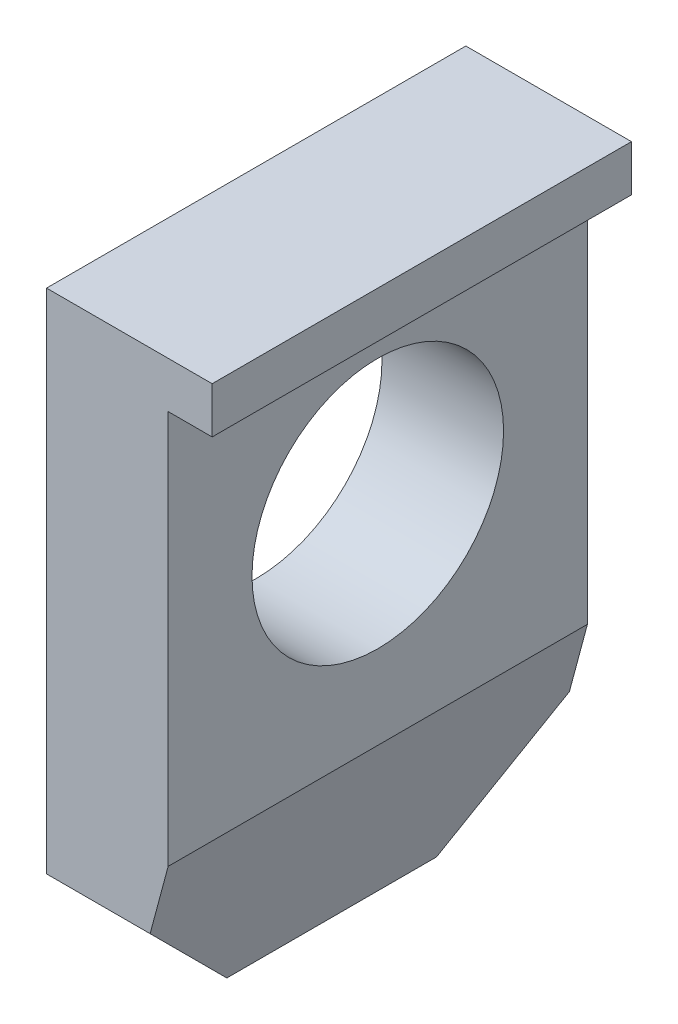
ISO-10303-21;
HEADER;
FILE_DESCRIPTION(('STEP AP214'),'2;1');
FILE_NAME('part.step','',(''),(''),'','','');
FILE_SCHEMA(('AUTOMOTIVE_DESIGN { 1 0 10303 214 1 1 1 1 }'));
ENDSEC;
DATA;
#1=APPLICATION_CONTEXT('core data for automotive mechanical design processes');
#2=APPLICATION_PROTOCOL_DEFINITION('international standard','automotive_design',2000,#1);
#3=PRODUCT_CONTEXT('',#1,'mechanical');
#4=PRODUCT('Part','Part','',(#3));
#5=PRODUCT_RELATED_PRODUCT_CATEGORY('part','',(#4));
#6=PRODUCT_DEFINITION_FORMATION('','',#4);
#7=PRODUCT_DEFINITION_CONTEXT('part definition',#1,'design');
#8=PRODUCT_DEFINITION('design','',#6,#7);
#9=PRODUCT_DEFINITION_SHAPE('','',#8);
#10=(LENGTH_UNIT() NAMED_UNIT(*) SI_UNIT(.MILLI.,.METRE.));
#11=(NAMED_UNIT(*) PLANE_ANGLE_UNIT() SI_UNIT($,.RADIAN.));
#12=(NAMED_UNIT(*) SI_UNIT($,.STERADIAN.) SOLID_ANGLE_UNIT());
#13=UNCERTAINTY_MEASURE_WITH_UNIT(LENGTH_MEASURE(1.E-05),#10,'distance_accuracy_value','');
#14=(GEOMETRIC_REPRESENTATION_CONTEXT(3) GLOBAL_UNCERTAINTY_ASSIGNED_CONTEXT((#13)) GLOBAL_UNIT_ASSIGNED_CONTEXT((#10,
#11,#12)) REPRESENTATION_CONTEXT('',''));
#15=CARTESIAN_POINT('',(0.,0.,0.));
#16=DIRECTION('',(0.,0.,1.));
#17=DIRECTION('',(1.,0.,0.));
#18=AXIS2_PLACEMENT_3D('',#15,#16,#17);
#19=CARTESIAN_POINT('',(0.,9.1,5.));
#20=DIRECTION('',(1.,0.,0.));
#21=DIRECTION('',(0.,1.,0.));
#22=AXIS2_PLACEMENT_3D('',#19,#20,#21);
#23=CYLINDRICAL_SURFACE('',#22,3.);
#24=CARTESIAN_POINT('',(0.,9.1,5.));
#25=DIRECTION('',(1.,0.,0.));
#26=DIRECTION('',(0.,1.,0.));
#27=AXIS2_PLACEMENT_3D('',#24,#25,#26);
#28=CIRCLE('',#27,3.);
#29=CARTESIAN_POINT('',(0.,6.1,5.));
#30=VERTEX_POINT('',#29);
#31=EDGE_CURVE('E184',#30,#30,#28,.T.);
#32=ORIENTED_EDGE('',*,*,#31,.F.);
#33=DIRECTION('',(1.,0.,0.));
#34=VECTOR('',#33,1.);
#35=CARTESIAN_POINT('',(0.,6.1,5.));
#36=LINE('',#35,#34);
#37=CARTESIAN_POINT('',(2.9,6.1,5.));
#38=VERTEX_POINT('',#37);
#39=EDGE_CURVE('E11',#30,#38,#36,.T.);
#40=ORIENTED_EDGE('',*,*,#39,.T.);
#41=CARTESIAN_POINT('',(2.9,9.1,5.));
#42=DIRECTION('',(1.,0.,0.));
#43=DIRECTION('',(0.,1.,0.));
#44=AXIS2_PLACEMENT_3D('',#41,#42,#43);
#45=CIRCLE('',#44,3.);
#46=EDGE_CURVE('E158',#38,#38,#45,.T.);
#47=ORIENTED_EDGE('',*,*,#46,.T.);
#48=ORIENTED_EDGE('',*,*,#39,.F.);
#49=EDGE_LOOP('',(#32,#40,#47,#48));
#50=FACE_BOUND('',#49,.T.);
#51=ADVANCED_FACE('F17',(#50),#23,.F.);
#52=CARTESIAN_POINT('',(0.,2.5,10.));
#53=DIRECTION('',(0.,0.707106781186548,-0.707106781186548));
#54=DIRECTION('',(-1.,0.,0.));
#55=AXIS2_PLACEMENT_3D('',#52,#53,#54);
#56=PLANE('',#55);
#57=DIRECTION('',(-0.186156787897391,-0.694746590606865,-0.694746590606865));
#58=VECTOR('',#57,1.);
#59=CARTESIAN_POINT('',(2.469872981078,2.5,10.));
#60=LINE('',#59,#58);
#61=CARTESIAN_POINT('',(2.469872981078,2.5,10.));
#62=VERTEX_POINT('',#61);
#63=CARTESIAN_POINT('',(1.8,0.,7.5));
#64=VERTEX_POINT('',#63);
#65=EDGE_CURVE('E226',#62,#64,#60,.T.);
#66=ORIENTED_EDGE('',*,*,#65,.F.);
#67=DIRECTION('',(1.,0.,0.));
#68=VECTOR('',#67,1.);
#69=CARTESIAN_POINT('',(0.,2.5,10.));
#70=LINE('',#69,#68);
#71=CARTESIAN_POINT('',(0.,2.5,10.));
#72=VERTEX_POINT('',#71);
#73=EDGE_CURVE('E28',#72,#62,#70,.T.);
#74=ORIENTED_EDGE('',*,*,#73,.F.);
#75=DIRECTION('',(0.,-0.707106781186548,-0.707106781186548));
#76=VECTOR('',#75,1.);
#77=CARTESIAN_POINT('',(0.,2.5,10.));
#78=LINE('',#77,#76);
#79=CARTESIAN_POINT('',(0.,0.,7.5));
#80=VERTEX_POINT('',#79);
#81=EDGE_CURVE('E96',#72,#80,#78,.T.);
#82=ORIENTED_EDGE('',*,*,#81,.T.);
#83=DIRECTION('',(1.,0.,0.));
#84=VECTOR('',#83,1.);
#85=CARTESIAN_POINT('',(0.,0.,7.5));
#86=LINE('',#85,#84);
#87=EDGE_CURVE('E188',#80,#64,#86,.T.);
#88=ORIENTED_EDGE('',*,*,#87,.T.);
#89=EDGE_LOOP('',(#66,#74,#82,#88));
#90=FACE_BOUND('',#89,.T.);
#91=ADVANCED_FACE('F344',(#90),#56,.F.);
#92=CARTESIAN_POINT('',(0.,0.,10.));
#93=DIRECTION('',(0.,0.,1.));
#94=DIRECTION('',(1.,0.,0.));
#95=AXIS2_PLACEMENT_3D('',#92,#93,#94);
#96=PLANE('',#95);
#97=ORIENTED_EDGE('',*,*,#73,.T.);
#98=DIRECTION('',(0.258819045102493,0.965925826289076,0.));
#99=VECTOR('',#98,1.);
#100=CARTESIAN_POINT('',(2.469872981078,2.5,10.));
#101=LINE('',#100,#99);
#102=CARTESIAN_POINT('',(2.9,4.105255888326,10.));
#103=VERTEX_POINT('',#102);
#104=EDGE_CURVE('E227',#62,#103,#101,.T.);
#105=ORIENTED_EDGE('',*,*,#104,.T.);
#106=DIRECTION('',(0.,1.,0.));
#107=VECTOR('',#106,1.);
#108=CARTESIAN_POINT('',(2.9,4.105255888326,10.));
#109=LINE('',#108,#107);
#110=CARTESIAN_POINT('',(2.9,13.5,10.));
#111=VERTEX_POINT('',#110);
#112=EDGE_CURVE('E21',#103,#111,#109,.T.);
#113=ORIENTED_EDGE('',*,*,#112,.T.);
#114=DIRECTION('',(1.,0.,0.));
#115=VECTOR('',#114,1.);
#116=CARTESIAN_POINT('',(2.9,13.5,10.));
#117=LINE('',#116,#115);
#118=CARTESIAN_POINT('',(3.95,13.5,10.));
#119=VERTEX_POINT('',#118);
#120=EDGE_CURVE('E165',#111,#119,#117,.T.);
#121=ORIENTED_EDGE('',*,*,#120,.T.);
#122=DIRECTION('',(0.,1.,0.));
#123=VECTOR('',#122,1.);
#124=CARTESIAN_POINT('',(3.95,13.5,10.));
#125=LINE('',#124,#123);
#126=CARTESIAN_POINT('',(3.95,14.6,10.));
#127=VERTEX_POINT('',#126);
#128=EDGE_CURVE('E177',#119,#127,#125,.T.);
#129=ORIENTED_EDGE('',*,*,#128,.T.);
#130=DIRECTION('',(-1.,0.,0.));
#131=VECTOR('',#130,1.);
#132=CARTESIAN_POINT('',(3.95,14.6,10.));
#133=LINE('',#132,#131);
#134=CARTESIAN_POINT('',(0.,14.6,10.));
#135=VERTEX_POINT('',#134);
#136=EDGE_CURVE('E181',#127,#135,#133,.T.);
#137=ORIENTED_EDGE('',*,*,#136,.T.);
#138=DIRECTION('',(0.,-1.,0.));
#139=VECTOR('',#138,1.);
#140=CARTESIAN_POINT('',(0.,14.6,10.));
#141=LINE('',#140,#139);
#142=EDGE_CURVE('E205',#135,#72,#141,.T.);
#143=ORIENTED_EDGE('',*,*,#142,.T.);
#144=EDGE_LOOP('',(#97,#105,#113,#121,#129,#137,#143));
#145=FACE_BOUND('',#144,.T.);
#146=ADVANCED_FACE('F339',(#145),#96,.T.);
#147=CARTESIAN_POINT('',(2.9,4.105255888326,0.));
#148=DIRECTION('',(1.,0.,0.));
#149=DIRECTION('',(0.,1.,0.));
#150=AXIS2_PLACEMENT_3D('',#147,#148,#149);
#151=PLANE('',#150);
#152=ORIENTED_EDGE('',*,*,#46,.F.);
#153=EDGE_LOOP('',(#152));
#154=FACE_BOUND('',#153,.T.);
#155=DIRECTION('',(0.,1.,0.));
#156=VECTOR('',#155,1.);
#157=CARTESIAN_POINT('',(2.9,4.105255888326,0.));
#158=LINE('',#157,#156);
#159=CARTESIAN_POINT('',(2.9,4.105255888326,0.));
#160=VERTEX_POINT('',#159);
#161=CARTESIAN_POINT('',(2.9,13.5,0.));
#162=VERTEX_POINT('',#161);
#163=EDGE_CURVE('E164',#160,#162,#158,.T.);
#164=ORIENTED_EDGE('',*,*,#163,.T.);
#165=DIRECTION('',(0.,0.,1.));
#166=VECTOR('',#165,1.);
#167=CARTESIAN_POINT('',(2.9,13.5,0.));
#168=LINE('',#167,#166);
#169=EDGE_CURVE('E168',#162,#111,#168,.T.);
#170=ORIENTED_EDGE('',*,*,#169,.T.);
#171=ORIENTED_EDGE('',*,*,#112,.F.);
#172=DIRECTION('',(0.,0.,1.));
#173=VECTOR('',#172,1.);
#174=CARTESIAN_POINT('',(2.9,4.105255888326,0.));
#175=LINE('',#174,#173);
#176=EDGE_CURVE('E132',#160,#103,#175,.T.);
#177=ORIENTED_EDGE('',*,*,#176,.F.);
#178=EDGE_LOOP('',(#164,#170,#171,#177));
#179=FACE_BOUND('',#178,.T.);
#180=ADVANCED_FACE('F332',(#154,#179),#151,.T.);
#181=CARTESIAN_POINT('',(2.9,13.5,0.));
#182=DIRECTION('',(0.,-1.,0.));
#183=DIRECTION('',(0.,0.,-1.));
#184=AXIS2_PLACEMENT_3D('',#181,#182,#183);
#185=PLANE('',#184);
#186=DIRECTION('',(1.,0.,0.));
#187=VECTOR('',#186,1.);
#188=CARTESIAN_POINT('',(2.9,13.5,0.));
#189=LINE('',#188,#187);
#190=CARTESIAN_POINT('',(3.95,13.5,0.));
#191=VERTEX_POINT('',#190);
#192=EDGE_CURVE('E172',#162,#191,#189,.T.);
#193=ORIENTED_EDGE('',*,*,#192,.T.);
#194=DIRECTION('',(0.,0.,1.));
#195=VECTOR('',#194,1.);
#196=CARTESIAN_POINT('',(3.95,13.5,0.));
#197=LINE('',#196,#195);
#198=EDGE_CURVE('E169',#191,#119,#197,.T.);
#199=ORIENTED_EDGE('',*,*,#198,.T.);
#200=ORIENTED_EDGE('',*,*,#120,.F.);
#201=ORIENTED_EDGE('',*,*,#169,.F.);
#202=EDGE_LOOP('',(#193,#199,#200,#201));
#203=FACE_BOUND('',#202,.T.);
#204=ADVANCED_FACE('F326',(#203),#185,.T.);
#205=CARTESIAN_POINT('',(3.95,13.5,0.));
#206=DIRECTION('',(1.,0.,0.));
#207=DIRECTION('',(0.,1.,0.));
#208=AXIS2_PLACEMENT_3D('',#205,#206,#207);
#209=PLANE('',#208);
#210=DIRECTION('',(0.,1.,0.));
#211=VECTOR('',#210,1.);
#212=CARTESIAN_POINT('',(3.95,13.5,0.));
#213=LINE('',#212,#211);
#214=CARTESIAN_POINT('',(3.95,14.6,0.));
#215=VERTEX_POINT('',#214);
#216=EDGE_CURVE('E176',#191,#215,#213,.T.);
#217=ORIENTED_EDGE('',*,*,#216,.T.);
#218=DIRECTION('',(0.,0.,1.));
#219=VECTOR('',#218,1.);
#220=CARTESIAN_POINT('',(3.95,14.6,0.));
#221=LINE('',#220,#219);
#222=EDGE_CURVE('E180',#215,#127,#221,.T.);
#223=ORIENTED_EDGE('',*,*,#222,.T.);
#224=ORIENTED_EDGE('',*,*,#128,.F.);
#225=ORIENTED_EDGE('',*,*,#198,.F.);
#226=EDGE_LOOP('',(#217,#223,#224,#225));
#227=FACE_BOUND('',#226,.T.);
#228=ADVANCED_FACE('F331',(#227),#209,.T.);
#229=CARTESIAN_POINT('',(3.95,14.6,0.));
#230=DIRECTION('',(0.,1.,0.));
#231=DIRECTION('',(1.,0.,0.));
#232=AXIS2_PLACEMENT_3D('',#229,#230,#231);
#233=PLANE('',#232);
#234=DIRECTION('',(-1.,0.,0.));
#235=VECTOR('',#234,1.);
#236=CARTESIAN_POINT('',(3.95,14.6,0.));
#237=LINE('',#236,#235);
#238=CARTESIAN_POINT('',(0.,14.6,0.));
#239=VERTEX_POINT('',#238);
#240=EDGE_CURVE('E144',#215,#239,#237,.T.);
#241=ORIENTED_EDGE('',*,*,#240,.T.);
#242=DIRECTION('',(0.,0.,1.));
#243=VECTOR('',#242,1.);
#244=CARTESIAN_POINT('',(0.,14.6,0.));
#245=LINE('',#244,#243);
#246=EDGE_CURVE('E139',#239,#135,#245,.T.);
#247=ORIENTED_EDGE('',*,*,#246,.T.);
#248=ORIENTED_EDGE('',*,*,#136,.F.);
#249=ORIENTED_EDGE('',*,*,#222,.F.);
#250=EDGE_LOOP('',(#241,#247,#248,#249));
#251=FACE_BOUND('',#250,.T.);
#252=ADVANCED_FACE('F319',(#251),#233,.T.);
#253=CARTESIAN_POINT('',(0.,14.6,0.));
#254=DIRECTION('',(-1.,0.,0.));
#255=DIRECTION('',(0.,0.,1.));
#256=AXIS2_PLACEMENT_3D('',#253,#254,#255);
#257=PLANE('',#256);
#258=ORIENTED_EDGE('',*,*,#31,.T.);
#259=EDGE_LOOP('',(#258));
#260=FACE_BOUND('',#259,.T.);
#261=DIRECTION('',(0.,0.707106781186548,-0.707106781186548));
#262=VECTOR('',#261,1.);
#263=CARTESIAN_POINT('',(0.,0.,2.5));
#264=LINE('',#263,#262);
#265=CARTESIAN_POINT('',(0.,0.,2.5));
#266=VERTEX_POINT('',#265);
#267=CARTESIAN_POINT('',(0.,2.5,0.));
#268=VERTEX_POINT('',#267);
#269=EDGE_CURVE('E123',#266,#268,#264,.T.);
#270=ORIENTED_EDGE('',*,*,#269,.F.);
#271=DIRECTION('',(0.,0.,1.));
#272=VECTOR('',#271,1.);
#273=CARTESIAN_POINT('',(0.,0.,2.5));
#274=LINE('',#273,#272);
#275=EDGE_CURVE('E185',#266,#80,#274,.T.);
#276=ORIENTED_EDGE('',*,*,#275,.T.);
#277=ORIENTED_EDGE('',*,*,#81,.F.);
#278=ORIENTED_EDGE('',*,*,#142,.F.);
#279=ORIENTED_EDGE('',*,*,#246,.F.);
#280=DIRECTION('',(0.,-1.,0.));
#281=VECTOR('',#280,1.);
#282=CARTESIAN_POINT('',(0.,14.6,0.));
#283=LINE('',#282,#281);
#284=EDGE_CURVE('E135',#239,#268,#283,.T.);
#285=ORIENTED_EDGE('',*,*,#284,.T.);
#286=EDGE_LOOP('',(#270,#276,#277,#278,#279,#285));
#287=FACE_BOUND('',#286,.T.);
#288=ADVANCED_FACE('F136',(#260,#287),#257,.T.);
#289=CARTESIAN_POINT('',(0.,0.,0.));
#290=DIRECTION('',(0.,-1.,0.));
#291=DIRECTION('',(0.,0.,-1.));
#292=AXIS2_PLACEMENT_3D('',#289,#290,#291);
#293=PLANE('',#292);
#294=DIRECTION('',(1.,0.,0.));
#295=VECTOR('',#294,1.);
#296=CARTESIAN_POINT('',(0.,0.,2.5));
#297=LINE('',#296,#295);
#298=CARTESIAN_POINT('',(1.8,0.,2.5));
#299=VERTEX_POINT('',#298);
#300=EDGE_CURVE('E129',#266,#299,#297,.T.);
#301=ORIENTED_EDGE('',*,*,#300,.T.);
#302=DIRECTION('',(0.,0.,1.));
#303=VECTOR('',#302,1.);
#304=CARTESIAN_POINT('',(1.8,0.,2.5));
#305=LINE('',#304,#303);
#306=EDGE_CURVE('E197',#299,#64,#305,.T.);
#307=ORIENTED_EDGE('',*,*,#306,.T.);
#308=ORIENTED_EDGE('',*,*,#87,.F.);
#309=ORIENTED_EDGE('',*,*,#275,.F.);
#310=EDGE_LOOP('',(#301,#307,#308,#309));
#311=FACE_BOUND('',#310,.T.);
#312=ADVANCED_FACE('F318',(#311),#293,.T.);
#313=CARTESIAN_POINT('',(1.8,0.,0.));
#314=DIRECTION('',(0.965925826289076,-0.258819045102493,0.));
#315=DIRECTION('',(0.,0.,-1.));
#316=AXIS2_PLACEMENT_3D('',#313,#314,#315);
#317=PLANE('',#316);
#318=DIRECTION('',(0.186156787897391,0.694746590606865,-0.694746590606865));
#319=VECTOR('',#318,1.);
#320=CARTESIAN_POINT('',(1.8,0.,2.5));
#321=LINE('',#320,#319);
#322=CARTESIAN_POINT('',(2.469872981078,2.5,0.));
#323=VERTEX_POINT('',#322);
#324=EDGE_CURVE('E163',#299,#323,#321,.T.);
#325=ORIENTED_EDGE('',*,*,#324,.T.);
#326=DIRECTION('',(0.258819045102493,0.965925826289076,0.));
#327=VECTOR('',#326,1.);
#328=CARTESIAN_POINT('',(2.469872981078,2.5,0.));
#329=LINE('',#328,#327);
#330=EDGE_CURVE('E150',#323,#160,#329,.T.);
#331=ORIENTED_EDGE('',*,*,#330,.T.);
#332=ORIENTED_EDGE('',*,*,#176,.T.);
#333=ORIENTED_EDGE('',*,*,#104,.F.);
#334=ORIENTED_EDGE('',*,*,#65,.T.);
#335=ORIENTED_EDGE('',*,*,#306,.F.);
#336=EDGE_LOOP('',(#325,#331,#332,#333,#334,#335));
#337=FACE_BOUND('',#336,.T.);
#338=ADVANCED_FACE('F350',(#337),#317,.T.);
#339=CARTESIAN_POINT('',(0.,0.,2.5));
#340=DIRECTION('',(0.,0.707106781186548,0.707106781186548));
#341=DIRECTION('',(1.,0.,0.));
#342=AXIS2_PLACEMENT_3D('',#339,#340,#341);
#343=PLANE('',#342);
#344=ORIENTED_EDGE('',*,*,#324,.F.);
#345=ORIENTED_EDGE('',*,*,#300,.F.);
#346=ORIENTED_EDGE('',*,*,#269,.T.);
#347=DIRECTION('',(1.,0.,0.));
#348=VECTOR('',#347,1.);
#349=CARTESIAN_POINT('',(0.,2.5,0.));
#350=LINE('',#349,#348);
#351=EDGE_CURVE('E127',#268,#323,#350,.T.);
#352=ORIENTED_EDGE('',*,*,#351,.T.);
#353=EDGE_LOOP('',(#344,#345,#346,#352));
#354=FACE_BOUND('',#353,.T.);
#355=ADVANCED_FACE('F19',(#354),#343,.F.);
#356=CARTESIAN_POINT('',(0.,0.,0.));
#357=DIRECTION('',(0.,0.,1.));
#358=DIRECTION('',(1.,0.,0.));
#359=AXIS2_PLACEMENT_3D('',#356,#357,#358);
#360=PLANE('',#359);
#361=ORIENTED_EDGE('',*,*,#351,.F.);
#362=ORIENTED_EDGE('',*,*,#284,.F.);
#363=ORIENTED_EDGE('',*,*,#240,.F.);
#364=ORIENTED_EDGE('',*,*,#216,.F.);
#365=ORIENTED_EDGE('',*,*,#192,.F.);
#366=ORIENTED_EDGE('',*,*,#163,.F.);
#367=ORIENTED_EDGE('',*,*,#330,.F.);
#368=EDGE_LOOP('',(#361,#362,#363,#364,#365,#366,#367));
#369=FACE_BOUND('',#368,.T.);
#370=ADVANCED_FACE('F147',(#369),#360,.F.);
#371=CLOSED_SHELL('',(#51,#91,#146,#180,#204,#228,#252,#288,#312,#338,#355,#370));
#372=MANIFOLD_SOLID_BREP('B1',#371);
#373=ADVANCED_BREP_SHAPE_REPRESENTATION('',(#18,#372),#14);
#374=SHAPE_DEFINITION_REPRESENTATION(#9,#373);
ENDSEC;
END-ISO-10303-21;
